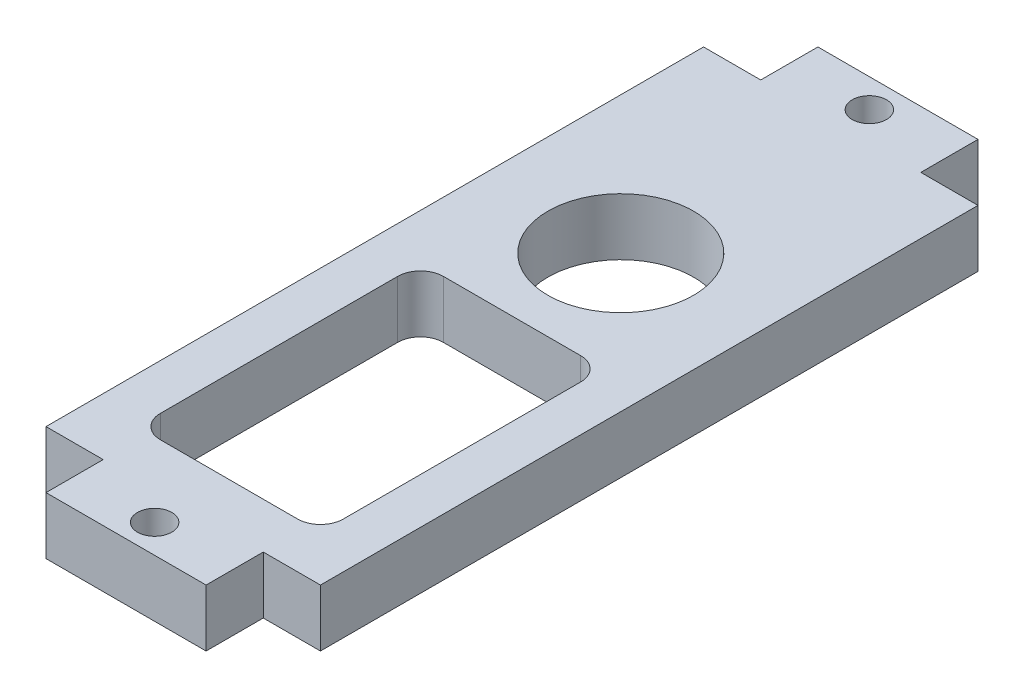
ISO-10303-21;
HEADER;
FILE_DESCRIPTION(('STEP AP214'),'2;1');
FILE_NAME('part.step','',(''),(''),'','','');
FILE_SCHEMA(('AUTOMOTIVE_DESIGN { 1 0 10303 214 1 1 1 1 }'));
ENDSEC;
DATA;
#1=APPLICATION_CONTEXT('core data for automotive mechanical design processes');
#2=APPLICATION_PROTOCOL_DEFINITION('international standard','automotive_design',2000,#1);
#3=PRODUCT_CONTEXT('',#1,'mechanical');
#4=PRODUCT('Part','Part','',(#3));
#5=PRODUCT_RELATED_PRODUCT_CATEGORY('part','',(#4));
#6=PRODUCT_DEFINITION_FORMATION('','',#4);
#7=PRODUCT_DEFINITION_CONTEXT('part definition',#1,'design');
#8=PRODUCT_DEFINITION('design','',#6,#7);
#9=PRODUCT_DEFINITION_SHAPE('','',#8);
#10=(LENGTH_UNIT() NAMED_UNIT(*) SI_UNIT(.MILLI.,.METRE.));
#11=(NAMED_UNIT(*) PLANE_ANGLE_UNIT() SI_UNIT($,.RADIAN.));
#12=(NAMED_UNIT(*) SI_UNIT($,.STERADIAN.) SOLID_ANGLE_UNIT());
#13=UNCERTAINTY_MEASURE_WITH_UNIT(LENGTH_MEASURE(1.E-05),#10,'distance_accuracy_value','');
#14=(GEOMETRIC_REPRESENTATION_CONTEXT(3) GLOBAL_UNCERTAINTY_ASSIGNED_CONTEXT((#13)) GLOBAL_UNIT_ASSIGNED_CONTEXT((#10,
#11,#12)) REPRESENTATION_CONTEXT('',''));
#15=CARTESIAN_POINT('',(0.,0.,0.));
#16=DIRECTION('',(0.,0.,1.));
#17=DIRECTION('',(1.,0.,0.));
#18=AXIS2_PLACEMENT_3D('',#15,#16,#17);
#19=CARTESIAN_POINT('',(0.,5.,0.));
#20=DIRECTION('',(0.,1.,0.));
#21=DIRECTION('',(0.,0.,1.));
#22=AXIS2_PLACEMENT_3D('',#19,#20,#21);
#23=PLANE('',#22);
#24=DIRECTION('',(1.,0.,0.));
#25=VECTOR('',#24,1.);
#26=CARTESIAN_POINT('',(0.,5.,5.));
#27=LINE('',#26,#25);
#28=CARTESIAN_POINT('',(6.,5.,5.));
#29=VERTEX_POINT('',#28);
#30=CARTESIAN_POINT('',(18.,5.,5.));
#31=VERTEX_POINT('',#30);
#32=EDGE_CURVE('E256',#29,#31,#27,.T.);
#33=ORIENTED_EDGE('',*,*,#32,.F.);
#34=CARTESIAN_POINT('',(6.,5.,3.));
#35=DIRECTION('',(0.,1.,0.));
#36=DIRECTION('',(0.,0.,1.));
#37=AXIS2_PLACEMENT_3D('',#34,#35,#36);
#38=CIRCLE('',#37,2.);
#39=CARTESIAN_POINT('',(4.,5.,3.));
#40=VERTEX_POINT('',#39);
#41=EDGE_CURVE('E240',#29,#40,#38,.F.);
#42=ORIENTED_EDGE('',*,*,#41,.T.);
#43=DIRECTION('',(0.,0.,-1.));
#44=VECTOR('',#43,1.);
#45=CARTESIAN_POINT('',(4.,5.,0.));
#46=LINE('',#45,#44);
#47=CARTESIAN_POINT('',(4.,5.,-17.75));
#48=VERTEX_POINT('',#47);
#49=EDGE_CURVE('E276',#40,#48,#46,.T.);
#50=ORIENTED_EDGE('',*,*,#49,.T.);
#51=CARTESIAN_POINT('',(6.,5.,-17.75));
#52=DIRECTION('',(0.,1.,0.));
#53=DIRECTION('',(0.,0.,1.));
#54=AXIS2_PLACEMENT_3D('',#51,#52,#53);
#55=CIRCLE('',#54,2.);
#56=CARTESIAN_POINT('',(6.,5.,-19.75));
#57=VERTEX_POINT('',#56);
#58=EDGE_CURVE('E55',#48,#57,#55,.F.);
#59=ORIENTED_EDGE('',*,*,#58,.T.);
#60=DIRECTION('',(1.,0.,0.));
#61=VECTOR('',#60,1.);
#62=CARTESIAN_POINT('',(0.,5.,-19.75));
#63=LINE('',#62,#61);
#64=CARTESIAN_POINT('',(18.,5.,-19.75));
#65=VERTEX_POINT('',#64);
#66=EDGE_CURVE('E251',#57,#65,#63,.T.);
#67=ORIENTED_EDGE('',*,*,#66,.T.);
#68=CARTESIAN_POINT('',(18.,5.,-17.75));
#69=DIRECTION('',(0.,1.,0.));
#70=DIRECTION('',(0.,0.,1.));
#71=AXIS2_PLACEMENT_3D('',#68,#69,#70);
#72=CIRCLE('',#71,2.);
#73=CARTESIAN_POINT('',(20.,5.,-17.75));
#74=VERTEX_POINT('',#73);
#75=EDGE_CURVE('E41',#65,#74,#72,.F.);
#76=ORIENTED_EDGE('',*,*,#75,.T.);
#77=DIRECTION('',(0.,0.,-1.));
#78=VECTOR('',#77,1.);
#79=CARTESIAN_POINT('',(20.,5.,0.));
#80=LINE('',#79,#78);
#81=CARTESIAN_POINT('',(20.,5.,3.));
#82=VERTEX_POINT('',#81);
#83=EDGE_CURVE('E250',#82,#74,#80,.T.);
#84=ORIENTED_EDGE('',*,*,#83,.F.);
#85=CARTESIAN_POINT('',(18.,5.,3.));
#86=DIRECTION('',(0.,1.,0.));
#87=DIRECTION('',(0.,0.,1.));
#88=AXIS2_PLACEMENT_3D('',#85,#86,#87);
#89=CIRCLE('',#88,2.);
#90=EDGE_CURVE('E236',#82,#31,#89,.F.);
#91=ORIENTED_EDGE('',*,*,#90,.T.);
#92=EDGE_LOOP('',(#33,#42,#50,#59,#67,#76,#84,#91));
#93=FACE_BOUND('',#92,.T.);
#94=CARTESIAN_POINT('',(12.,5.,-29.26));
#95=DIRECTION('',(0.,1.,0.));
#96=DIRECTION('',(0.,0.,1.));
#97=AXIS2_PLACEMENT_3D('',#94,#95,#96);
#98=CIRCLE('',#97,6.375);
#99=CARTESIAN_POINT('',(12.,5.,-22.885));
#100=VERTEX_POINT('',#99);
#101=EDGE_CURVE('E207',#100,#100,#98,.T.);
#102=ORIENTED_EDGE('',*,*,#101,.F.);
#103=EDGE_LOOP('',(#102));
#104=FACE_BOUND('',#103,.T.);
#105=CARTESIAN_POINT('',(12.,5.,-51.));
#106=DIRECTION('',(0.,1.,0.));
#107=DIRECTION('',(0.,0.,1.));
#108=AXIS2_PLACEMENT_3D('',#105,#106,#107);
#109=CIRCLE('',#108,1.5);
#110=CARTESIAN_POINT('',(12.,5.,-49.5));
#111=VERTEX_POINT('',#110);
#112=EDGE_CURVE('E300',#111,#111,#109,.T.);
#113=ORIENTED_EDGE('',*,*,#112,.F.);
#114=EDGE_LOOP('',(#113));
#115=FACE_BOUND('',#114,.T.);
#116=DIRECTION('',(0.,0.,1.));
#117=VECTOR('',#116,1.);
#118=CARTESIAN_POINT('',(5.,5.,-53.5));
#119=LINE('',#118,#117);
#120=CARTESIAN_POINT('',(5.,5.,-53.5));
#121=VERTEX_POINT('',#120);
#122=CARTESIAN_POINT('',(5.,5.,-48.5));
#123=VERTEX_POINT('',#122);
#124=EDGE_CURVE('E181',#121,#123,#119,.T.);
#125=ORIENTED_EDGE('',*,*,#124,.T.);
#126=DIRECTION('',(-1.,0.,0.));
#127=VECTOR('',#126,1.);
#128=CARTESIAN_POINT('',(0.,5.,-48.5));
#129=LINE('',#128,#127);
#130=CARTESIAN_POINT('',(0.,5.,-48.5));
#131=VERTEX_POINT('',#130);
#132=EDGE_CURVE('E170',#123,#131,#129,.T.);
#133=ORIENTED_EDGE('',*,*,#132,.T.);
#134=DIRECTION('',(0.,0.,1.));
#135=VECTOR('',#134,1.);
#136=CARTESIAN_POINT('',(0.,5.,9.));
#137=LINE('',#136,#135);
#138=CARTESIAN_POINT('',(0.,5.,9.));
#139=VERTEX_POINT('',#138);
#140=EDGE_CURVE('E180',#131,#139,#137,.T.);
#141=ORIENTED_EDGE('',*,*,#140,.T.);
#142=DIRECTION('',(1.,0.,0.));
#143=VECTOR('',#142,1.);
#144=CARTESIAN_POINT('',(0.,5.,9.));
#145=LINE('',#144,#143);
#146=CARTESIAN_POINT('',(5.,5.,9.));
#147=VERTEX_POINT('',#146);
#148=EDGE_CURVE('E306',#139,#147,#145,.T.);
#149=ORIENTED_EDGE('',*,*,#148,.T.);
#150=DIRECTION('',(0.,0.,1.));
#151=VECTOR('',#150,1.);
#152=CARTESIAN_POINT('',(5.,5.,14.));
#153=LINE('',#152,#151);
#154=CARTESIAN_POINT('',(5.,5.,14.));
#155=VERTEX_POINT('',#154);
#156=EDGE_CURVE('E308',#147,#155,#153,.T.);
#157=ORIENTED_EDGE('',*,*,#156,.T.);
#158=DIRECTION('',(1.,0.,0.));
#159=VECTOR('',#158,1.);
#160=CARTESIAN_POINT('',(5.,5.,14.));
#161=LINE('',#160,#159);
#162=CARTESIAN_POINT('',(19.,5.,14.));
#163=VERTEX_POINT('',#162);
#164=EDGE_CURVE('E310',#155,#163,#161,.T.);
#165=ORIENTED_EDGE('',*,*,#164,.T.);
#166=DIRECTION('',(0.,0.,-1.));
#167=VECTOR('',#166,1.);
#168=CARTESIAN_POINT('',(19.,5.,14.));
#169=LINE('',#168,#167);
#170=CARTESIAN_POINT('',(19.,5.,9.00000000000001));
#171=VERTEX_POINT('',#170);
#172=EDGE_CURVE('E312',#163,#171,#169,.T.);
#173=ORIENTED_EDGE('',*,*,#172,.T.);
#174=DIRECTION('',(1.,0.,0.));
#175=VECTOR('',#174,1.);
#176=CARTESIAN_POINT('',(24.,5.,9.00000000000001));
#177=LINE('',#176,#175);
#178=CARTESIAN_POINT('',(24.,5.,9.00000000000001));
#179=VERTEX_POINT('',#178);
#180=EDGE_CURVE('E314',#171,#179,#177,.T.);
#181=ORIENTED_EDGE('',*,*,#180,.T.);
#182=DIRECTION('',(0.,0.,-1.));
#183=VECTOR('',#182,1.);
#184=CARTESIAN_POINT('',(24.,5.,9.00000000000001));
#185=LINE('',#184,#183);
#186=CARTESIAN_POINT('',(24.,5.,-48.5));
#187=VERTEX_POINT('',#186);
#188=EDGE_CURVE('E316',#179,#187,#185,.T.);
#189=ORIENTED_EDGE('',*,*,#188,.T.);
#190=DIRECTION('',(-1.,0.,0.));
#191=VECTOR('',#190,1.);
#192=CARTESIAN_POINT('',(24.,5.,-48.5));
#193=LINE('',#192,#191);
#194=CARTESIAN_POINT('',(19.,5.,-48.5));
#195=VERTEX_POINT('',#194);
#196=EDGE_CURVE('E318',#187,#195,#193,.T.);
#197=ORIENTED_EDGE('',*,*,#196,.T.);
#198=DIRECTION('',(0.,0.,-1.));
#199=VECTOR('',#198,1.);
#200=CARTESIAN_POINT('',(19.,5.,-53.5));
#201=LINE('',#200,#199);
#202=CARTESIAN_POINT('',(19.,5.,-53.5));
#203=VERTEX_POINT('',#202);
#204=EDGE_CURVE('E320',#195,#203,#201,.T.);
#205=ORIENTED_EDGE('',*,*,#204,.T.);
#206=DIRECTION('',(-1.,0.,0.));
#207=VECTOR('',#206,1.);
#208=CARTESIAN_POINT('',(5.,5.,-53.5));
#209=LINE('',#208,#207);
#210=EDGE_CURVE('E186',#203,#121,#209,.T.);
#211=ORIENTED_EDGE('',*,*,#210,.T.);
#212=EDGE_LOOP('',(#125,#133,#141,#149,#157,#165,#173,#181,#189,#197,#205,#211));
#213=FACE_BOUND('',#212,.T.);
#214=CARTESIAN_POINT('',(12.,5.,11.5));
#215=DIRECTION('',(0.,1.,0.));
#216=DIRECTION('',(0.,0.,-1.));
#217=AXIS2_PLACEMENT_3D('',#214,#215,#216);
#218=CIRCLE('',#217,1.5);
#219=CARTESIAN_POINT('',(12.,5.,10.));
#220=VERTEX_POINT('',#219);
#221=EDGE_CURVE('E294',#220,#220,#218,.T.);
#222=ORIENTED_EDGE('',*,*,#221,.F.);
#223=EDGE_LOOP('',(#222));
#224=FACE_BOUND('',#223,.T.);
#225=ADVANCED_FACE('F33',(#93,#104,#115,#213,#224),#23,.T.);
#226=CARTESIAN_POINT('',(0.,0.,0.));
#227=DIRECTION('',(0.,1.,0.));
#228=DIRECTION('',(0.,0.,1.));
#229=AXIS2_PLACEMENT_3D('',#226,#227,#228);
#230=PLANE('',#229);
#231=DIRECTION('',(0.,0.,-1.));
#232=VECTOR('',#231,1.);
#233=CARTESIAN_POINT('',(4.,0.,0.));
#234=LINE('',#233,#232);
#235=CARTESIAN_POINT('',(4.,0.,3.));
#236=VERTEX_POINT('',#235);
#237=CARTESIAN_POINT('',(4.,0.,-17.75));
#238=VERTEX_POINT('',#237);
#239=EDGE_CURVE('E211',#236,#238,#234,.T.);
#240=ORIENTED_EDGE('',*,*,#239,.F.);
#241=CARTESIAN_POINT('',(6.,0.,3.));
#242=DIRECTION('',(0.,1.,0.));
#243=DIRECTION('',(0.,0.,1.));
#244=AXIS2_PLACEMENT_3D('',#241,#242,#243);
#245=CIRCLE('',#244,2.);
#246=CARTESIAN_POINT('',(6.,0.,5.));
#247=VERTEX_POINT('',#246);
#248=EDGE_CURVE('E242',#236,#247,#245,.T.);
#249=ORIENTED_EDGE('',*,*,#248,.T.);
#250=DIRECTION('',(1.,0.,0.));
#251=VECTOR('',#250,1.);
#252=CARTESIAN_POINT('',(0.,0.,5.));
#253=LINE('',#252,#251);
#254=CARTESIAN_POINT('',(18.,0.,5.));
#255=VERTEX_POINT('',#254);
#256=EDGE_CURVE('E214',#247,#255,#253,.T.);
#257=ORIENTED_EDGE('',*,*,#256,.T.);
#258=CARTESIAN_POINT('',(18.,0.,3.));
#259=DIRECTION('',(0.,1.,0.));
#260=DIRECTION('',(0.,0.,1.));
#261=AXIS2_PLACEMENT_3D('',#258,#259,#260);
#262=CIRCLE('',#261,2.);
#263=CARTESIAN_POINT('',(20.,0.,3.));
#264=VERTEX_POINT('',#263);
#265=EDGE_CURVE('E238',#255,#264,#262,.T.);
#266=ORIENTED_EDGE('',*,*,#265,.T.);
#267=DIRECTION('',(0.,0.,-1.));
#268=VECTOR('',#267,1.);
#269=CARTESIAN_POINT('',(20.,0.,0.));
#270=LINE('',#269,#268);
#271=CARTESIAN_POINT('',(20.,0.,-17.75));
#272=VERTEX_POINT('',#271);
#273=EDGE_CURVE('E195',#264,#272,#270,.T.);
#274=ORIENTED_EDGE('',*,*,#273,.T.);
#275=CARTESIAN_POINT('',(18.,0.,-17.75));
#276=DIRECTION('',(0.,1.,0.));
#277=DIRECTION('',(0.,0.,1.));
#278=AXIS2_PLACEMENT_3D('',#275,#276,#277);
#279=CIRCLE('',#278,2.);
#280=CARTESIAN_POINT('',(18.,0.,-19.75));
#281=VERTEX_POINT('',#280);
#282=EDGE_CURVE('E11',#272,#281,#279,.T.);
#283=ORIENTED_EDGE('',*,*,#282,.T.);
#284=DIRECTION('',(1.,0.,0.));
#285=VECTOR('',#284,1.);
#286=CARTESIAN_POINT('',(0.,0.,-19.75));
#287=LINE('',#286,#285);
#288=CARTESIAN_POINT('',(6.,0.,-19.75));
#289=VERTEX_POINT('',#288);
#290=EDGE_CURVE('E198',#289,#281,#287,.T.);
#291=ORIENTED_EDGE('',*,*,#290,.F.);
#292=CARTESIAN_POINT('',(6.,0.,-17.75));
#293=DIRECTION('',(0.,1.,0.));
#294=DIRECTION('',(0.,0.,1.));
#295=AXIS2_PLACEMENT_3D('',#292,#293,#294);
#296=CIRCLE('',#295,2.);
#297=EDGE_CURVE('E245',#289,#238,#296,.T.);
#298=ORIENTED_EDGE('',*,*,#297,.T.);
#299=EDGE_LOOP('',(#240,#249,#257,#266,#274,#283,#291,#298));
#300=FACE_BOUND('',#299,.T.);
#301=CARTESIAN_POINT('',(12.,0.,-29.26));
#302=DIRECTION('',(0.,1.,0.));
#303=DIRECTION('',(0.,0.,1.));
#304=AXIS2_PLACEMENT_3D('',#301,#302,#303);
#305=CIRCLE('',#304,6.375);
#306=CARTESIAN_POINT('',(12.,0.,-22.885));
#307=VERTEX_POINT('',#306);
#308=EDGE_CURVE('E204',#307,#307,#305,.T.);
#309=ORIENTED_EDGE('',*,*,#308,.T.);
#310=EDGE_LOOP('',(#309));
#311=FACE_BOUND('',#310,.T.);
#312=DIRECTION('',(0.,0.,1.));
#313=VECTOR('',#312,1.);
#314=CARTESIAN_POINT('',(5.,0.,-53.5));
#315=LINE('',#314,#313);
#316=CARTESIAN_POINT('',(5.,0.,-53.5));
#317=VERTEX_POINT('',#316);
#318=CARTESIAN_POINT('',(5.,0.,-48.5));
#319=VERTEX_POINT('',#318);
#320=EDGE_CURVE('E194',#317,#319,#315,.T.);
#321=ORIENTED_EDGE('',*,*,#320,.F.);
#322=DIRECTION('',(-1.,0.,0.));
#323=VECTOR('',#322,1.);
#324=CARTESIAN_POINT('',(5.,0.,-53.5));
#325=LINE('',#324,#323);
#326=CARTESIAN_POINT('',(19.,0.,-53.5));
#327=VERTEX_POINT('',#326);
#328=EDGE_CURVE('E190',#327,#317,#325,.T.);
#329=ORIENTED_EDGE('',*,*,#328,.F.);
#330=DIRECTION('',(0.,0.,-1.));
#331=VECTOR('',#330,1.);
#332=CARTESIAN_POINT('',(19.,0.,-53.5));
#333=LINE('',#332,#331);
#334=CARTESIAN_POINT('',(19.,0.,-48.5));
#335=VERTEX_POINT('',#334);
#336=EDGE_CURVE('E343',#335,#327,#333,.T.);
#337=ORIENTED_EDGE('',*,*,#336,.F.);
#338=DIRECTION('',(-1.,0.,0.));
#339=VECTOR('',#338,1.);
#340=CARTESIAN_POINT('',(24.,0.,-48.5));
#341=LINE('',#340,#339);
#342=CARTESIAN_POINT('',(24.,0.,-48.5));
#343=VERTEX_POINT('',#342);
#344=EDGE_CURVE('E341',#343,#335,#341,.T.);
#345=ORIENTED_EDGE('',*,*,#344,.F.);
#346=DIRECTION('',(0.,0.,-1.));
#347=VECTOR('',#346,1.);
#348=CARTESIAN_POINT('',(24.,0.,9.00000000000001));
#349=LINE('',#348,#347);
#350=CARTESIAN_POINT('',(24.,0.,9.00000000000001));
#351=VERTEX_POINT('',#350);
#352=EDGE_CURVE('E339',#351,#343,#349,.T.);
#353=ORIENTED_EDGE('',*,*,#352,.F.);
#354=DIRECTION('',(1.,0.,0.));
#355=VECTOR('',#354,1.);
#356=CARTESIAN_POINT('',(24.,0.,9.00000000000001));
#357=LINE('',#356,#355);
#358=CARTESIAN_POINT('',(19.,0.,9.00000000000001));
#359=VERTEX_POINT('',#358);
#360=EDGE_CURVE('E337',#359,#351,#357,.T.);
#361=ORIENTED_EDGE('',*,*,#360,.F.);
#362=DIRECTION('',(0.,0.,-1.));
#363=VECTOR('',#362,1.);
#364=CARTESIAN_POINT('',(19.,0.,14.));
#365=LINE('',#364,#363);
#366=CARTESIAN_POINT('',(19.,0.,14.));
#367=VERTEX_POINT('',#366);
#368=EDGE_CURVE('E335',#367,#359,#365,.T.);
#369=ORIENTED_EDGE('',*,*,#368,.F.);
#370=DIRECTION('',(1.,0.,0.));
#371=VECTOR('',#370,1.);
#372=CARTESIAN_POINT('',(5.,0.,14.));
#373=LINE('',#372,#371);
#374=CARTESIAN_POINT('',(5.,0.,14.));
#375=VERTEX_POINT('',#374);
#376=EDGE_CURVE('E333',#375,#367,#373,.T.);
#377=ORIENTED_EDGE('',*,*,#376,.F.);
#378=DIRECTION('',(0.,0.,1.));
#379=VECTOR('',#378,1.);
#380=CARTESIAN_POINT('',(5.,0.,14.));
#381=LINE('',#380,#379);
#382=CARTESIAN_POINT('',(5.,0.,9.));
#383=VERTEX_POINT('',#382);
#384=EDGE_CURVE('E331',#383,#375,#381,.T.);
#385=ORIENTED_EDGE('',*,*,#384,.F.);
#386=DIRECTION('',(1.,0.,0.));
#387=VECTOR('',#386,1.);
#388=CARTESIAN_POINT('',(0.,0.,9.));
#389=LINE('',#388,#387);
#390=CARTESIAN_POINT('',(0.,0.,9.));
#391=VERTEX_POINT('',#390);
#392=EDGE_CURVE('E329',#391,#383,#389,.T.);
#393=ORIENTED_EDGE('',*,*,#392,.F.);
#394=DIRECTION('',(0.,0.,1.));
#395=VECTOR('',#394,1.);
#396=CARTESIAN_POINT('',(0.,0.,9.));
#397=LINE('',#396,#395);
#398=CARTESIAN_POINT('',(0.,0.,-48.5));
#399=VERTEX_POINT('',#398);
#400=EDGE_CURVE('E327',#399,#391,#397,.T.);
#401=ORIENTED_EDGE('',*,*,#400,.F.);
#402=DIRECTION('',(-1.,0.,0.));
#403=VECTOR('',#402,1.);
#404=CARTESIAN_POINT('',(0.,0.,-48.5));
#405=LINE('',#404,#403);
#406=EDGE_CURVE('E325',#319,#399,#405,.T.);
#407=ORIENTED_EDGE('',*,*,#406,.F.);
#408=EDGE_LOOP('',(#321,#329,#337,#345,#353,#361,#369,#377,#385,#393,#401,#407));
#409=FACE_BOUND('',#408,.T.);
#410=CARTESIAN_POINT('',(12.,0.,-51.));
#411=DIRECTION('',(0.,1.,0.));
#412=DIRECTION('',(0.,0.,1.));
#413=AXIS2_PLACEMENT_3D('',#410,#411,#412);
#414=CIRCLE('',#413,1.5);
#415=CARTESIAN_POINT('',(12.,0.,-49.5));
#416=VERTEX_POINT('',#415);
#417=EDGE_CURVE('E297',#416,#416,#414,.T.);
#418=ORIENTED_EDGE('',*,*,#417,.T.);
#419=EDGE_LOOP('',(#418));
#420=FACE_BOUND('',#419,.T.);
#421=CARTESIAN_POINT('',(12.,0.,11.5));
#422=DIRECTION('',(0.,1.,0.));
#423=DIRECTION('',(0.,0.,-1.));
#424=AXIS2_PLACEMENT_3D('',#421,#422,#423);
#425=CIRCLE('',#424,1.5);
#426=CARTESIAN_POINT('',(12.,0.,10.));
#427=VERTEX_POINT('',#426);
#428=EDGE_CURVE('E206',#427,#427,#425,.T.);
#429=ORIENTED_EDGE('',*,*,#428,.T.);
#430=EDGE_LOOP('',(#429));
#431=FACE_BOUND('',#430,.T.);
#432=ADVANCED_FACE('F262',(#300,#311,#409,#420,#431),#230,.F.);
#433=CARTESIAN_POINT('',(5.,5.,-53.5));
#434=DIRECTION('',(1.,0.,0.));
#435=DIRECTION('',(0.,0.,-1.));
#436=AXIS2_PLACEMENT_3D('',#433,#434,#435);
#437=PLANE('',#436);
#438=ORIENTED_EDGE('',*,*,#320,.T.);
#439=DIRECTION('',(0.,-1.,0.));
#440=VECTOR('',#439,1.);
#441=CARTESIAN_POINT('',(5.,5.,-48.5));
#442=LINE('',#441,#440);
#443=EDGE_CURVE('E174',#123,#319,#442,.T.);
#444=ORIENTED_EDGE('',*,*,#443,.F.);
#445=ORIENTED_EDGE('',*,*,#124,.F.);
#446=DIRECTION('',(0.,-1.,0.));
#447=VECTOR('',#446,1.);
#448=CARTESIAN_POINT('',(5.,5.,-53.5));
#449=LINE('',#448,#447);
#450=EDGE_CURVE('E323',#121,#317,#449,.T.);
#451=ORIENTED_EDGE('',*,*,#450,.T.);
#452=EDGE_LOOP('',(#438,#444,#445,#451));
#453=FACE_BOUND('',#452,.T.);
#454=ADVANCED_FACE('F192',(#453),#437,.F.);
#455=CARTESIAN_POINT('',(0.,5.,-48.5));
#456=DIRECTION('',(0.,0.,1.));
#457=DIRECTION('',(1.,0.,0.));
#458=AXIS2_PLACEMENT_3D('',#455,#456,#457);
#459=PLANE('',#458);
#460=ORIENTED_EDGE('',*,*,#406,.T.);
#461=DIRECTION('',(0.,-1.,0.));
#462=VECTOR('',#461,1.);
#463=CARTESIAN_POINT('',(0.,5.,-48.5));
#464=LINE('',#463,#462);
#465=EDGE_CURVE('E177',#131,#399,#464,.T.);
#466=ORIENTED_EDGE('',*,*,#465,.F.);
#467=ORIENTED_EDGE('',*,*,#132,.F.);
#468=ORIENTED_EDGE('',*,*,#443,.T.);
#469=EDGE_LOOP('',(#460,#466,#467,#468));
#470=FACE_BOUND('',#469,.T.);
#471=ADVANCED_FACE('F172',(#470),#459,.F.);
#472=CARTESIAN_POINT('',(0.,5.,9.));
#473=DIRECTION('',(1.,0.,0.));
#474=DIRECTION('',(0.,0.,-1.));
#475=AXIS2_PLACEMENT_3D('',#472,#473,#474);
#476=PLANE('',#475);
#477=ORIENTED_EDGE('',*,*,#400,.T.);
#478=DIRECTION('',(0.,-1.,0.));
#479=VECTOR('',#478,1.);
#480=CARTESIAN_POINT('',(0.,5.,9.));
#481=LINE('',#480,#479);
#482=EDGE_CURVE('E200',#139,#391,#481,.T.);
#483=ORIENTED_EDGE('',*,*,#482,.F.);
#484=ORIENTED_EDGE('',*,*,#140,.F.);
#485=ORIENTED_EDGE('',*,*,#465,.T.);
#486=EDGE_LOOP('',(#477,#483,#484,#485));
#487=FACE_BOUND('',#486,.T.);
#488=ADVANCED_FACE('F394',(#487),#476,.F.);
#489=CARTESIAN_POINT('',(0.,5.,9.));
#490=DIRECTION('',(0.,0.,-1.));
#491=DIRECTION('',(-1.,0.,0.));
#492=AXIS2_PLACEMENT_3D('',#489,#490,#491);
#493=PLANE('',#492);
#494=ORIENTED_EDGE('',*,*,#392,.T.);
#495=DIRECTION('',(0.,-1.,0.));
#496=VECTOR('',#495,1.);
#497=CARTESIAN_POINT('',(5.,5.,9.));
#498=LINE('',#497,#496);
#499=EDGE_CURVE('E368',#147,#383,#498,.T.);
#500=ORIENTED_EDGE('',*,*,#499,.F.);
#501=ORIENTED_EDGE('',*,*,#148,.F.);
#502=ORIENTED_EDGE('',*,*,#482,.T.);
#503=EDGE_LOOP('',(#494,#500,#501,#502));
#504=FACE_BOUND('',#503,.T.);
#505=ADVANCED_FACE('F375',(#504),#493,.F.);
#506=CARTESIAN_POINT('',(5.,5.,14.));
#507=DIRECTION('',(1.,0.,0.));
#508=DIRECTION('',(0.,0.,-1.));
#509=AXIS2_PLACEMENT_3D('',#506,#507,#508);
#510=PLANE('',#509);
#511=ORIENTED_EDGE('',*,*,#384,.T.);
#512=DIRECTION('',(0.,-1.,0.));
#513=VECTOR('',#512,1.);
#514=CARTESIAN_POINT('',(5.,5.,14.));
#515=LINE('',#514,#513);
#516=EDGE_CURVE('E365',#155,#375,#515,.T.);
#517=ORIENTED_EDGE('',*,*,#516,.F.);
#518=ORIENTED_EDGE('',*,*,#156,.F.);
#519=ORIENTED_EDGE('',*,*,#499,.T.);
#520=EDGE_LOOP('',(#511,#517,#518,#519));
#521=FACE_BOUND('',#520,.T.);
#522=ADVANCED_FACE('F386',(#521),#510,.F.);
#523=CARTESIAN_POINT('',(5.,5.,14.));
#524=DIRECTION('',(0.,0.,-1.));
#525=DIRECTION('',(-1.,0.,0.));
#526=AXIS2_PLACEMENT_3D('',#523,#524,#525);
#527=PLANE('',#526);
#528=ORIENTED_EDGE('',*,*,#376,.T.);
#529=DIRECTION('',(0.,-1.,0.));
#530=VECTOR('',#529,1.);
#531=CARTESIAN_POINT('',(19.,5.,14.));
#532=LINE('',#531,#530);
#533=EDGE_CURVE('E362',#163,#367,#532,.T.);
#534=ORIENTED_EDGE('',*,*,#533,.F.);
#535=ORIENTED_EDGE('',*,*,#164,.F.);
#536=ORIENTED_EDGE('',*,*,#516,.T.);
#537=EDGE_LOOP('',(#528,#534,#535,#536));
#538=FACE_BOUND('',#537,.T.);
#539=ADVANCED_FACE('F390',(#538),#527,.F.);
#540=CARTESIAN_POINT('',(19.,5.,14.));
#541=DIRECTION('',(-1.,0.,0.));
#542=DIRECTION('',(0.,0.,1.));
#543=AXIS2_PLACEMENT_3D('',#540,#541,#542);
#544=PLANE('',#543);
#545=ORIENTED_EDGE('',*,*,#368,.T.);
#546=DIRECTION('',(0.,-1.,0.));
#547=VECTOR('',#546,1.);
#548=CARTESIAN_POINT('',(19.,5.,9.00000000000001));
#549=LINE('',#548,#547);
#550=EDGE_CURVE('E359',#171,#359,#549,.T.);
#551=ORIENTED_EDGE('',*,*,#550,.F.);
#552=ORIENTED_EDGE('',*,*,#172,.F.);
#553=ORIENTED_EDGE('',*,*,#533,.T.);
#554=EDGE_LOOP('',(#545,#551,#552,#553));
#555=FACE_BOUND('',#554,.T.);
#556=ADVANCED_FACE('F432',(#555),#544,.F.);
#557=CARTESIAN_POINT('',(24.,5.,9.00000000000001));
#558=DIRECTION('',(0.,0.,-1.));
#559=DIRECTION('',(-1.,0.,0.));
#560=AXIS2_PLACEMENT_3D('',#557,#558,#559);
#561=PLANE('',#560);
#562=ORIENTED_EDGE('',*,*,#360,.T.);
#563=DIRECTION('',(0.,-1.,0.));
#564=VECTOR('',#563,1.);
#565=CARTESIAN_POINT('',(24.,5.,9.00000000000001));
#566=LINE('',#565,#564);
#567=EDGE_CURVE('E356',#179,#351,#566,.T.);
#568=ORIENTED_EDGE('',*,*,#567,.F.);
#569=ORIENTED_EDGE('',*,*,#180,.F.);
#570=ORIENTED_EDGE('',*,*,#550,.T.);
#571=EDGE_LOOP('',(#562,#568,#569,#570));
#572=FACE_BOUND('',#571,.T.);
#573=ADVANCED_FACE('F428',(#572),#561,.F.);
#574=CARTESIAN_POINT('',(24.,5.,9.00000000000001));
#575=DIRECTION('',(-1.,0.,0.));
#576=DIRECTION('',(0.,0.,1.));
#577=AXIS2_PLACEMENT_3D('',#574,#575,#576);
#578=PLANE('',#577);
#579=ORIENTED_EDGE('',*,*,#352,.T.);
#580=DIRECTION('',(0.,-1.,0.));
#581=VECTOR('',#580,1.);
#582=CARTESIAN_POINT('',(24.,5.,-48.5));
#583=LINE('',#582,#581);
#584=EDGE_CURVE('E353',#187,#343,#583,.T.);
#585=ORIENTED_EDGE('',*,*,#584,.F.);
#586=ORIENTED_EDGE('',*,*,#188,.F.);
#587=ORIENTED_EDGE('',*,*,#567,.T.);
#588=EDGE_LOOP('',(#579,#585,#586,#587));
#589=FACE_BOUND('',#588,.T.);
#590=ADVANCED_FACE('F424',(#589),#578,.F.);
#591=CARTESIAN_POINT('',(24.,5.,-48.5));
#592=DIRECTION('',(0.,0.,1.));
#593=DIRECTION('',(1.,0.,0.));
#594=AXIS2_PLACEMENT_3D('',#591,#592,#593);
#595=PLANE('',#594);
#596=ORIENTED_EDGE('',*,*,#344,.T.);
#597=DIRECTION('',(0.,-1.,0.));
#598=VECTOR('',#597,1.);
#599=CARTESIAN_POINT('',(19.,5.,-48.5));
#600=LINE('',#599,#598);
#601=EDGE_CURVE('E350',#195,#335,#600,.T.);
#602=ORIENTED_EDGE('',*,*,#601,.F.);
#603=ORIENTED_EDGE('',*,*,#196,.F.);
#604=ORIENTED_EDGE('',*,*,#584,.T.);
#605=EDGE_LOOP('',(#596,#602,#603,#604));
#606=FACE_BOUND('',#605,.T.);
#607=ADVANCED_FACE('F420',(#606),#595,.F.);
#608=CARTESIAN_POINT('',(19.,5.,-53.5));
#609=DIRECTION('',(-1.,0.,0.));
#610=DIRECTION('',(0.,0.,1.));
#611=AXIS2_PLACEMENT_3D('',#608,#609,#610);
#612=PLANE('',#611);
#613=ORIENTED_EDGE('',*,*,#336,.T.);
#614=DIRECTION('',(0.,-1.,0.));
#615=VECTOR('',#614,1.);
#616=CARTESIAN_POINT('',(19.,5.,-53.5));
#617=LINE('',#616,#615);
#618=EDGE_CURVE('E347',#203,#327,#617,.T.);
#619=ORIENTED_EDGE('',*,*,#618,.F.);
#620=ORIENTED_EDGE('',*,*,#204,.F.);
#621=ORIENTED_EDGE('',*,*,#601,.T.);
#622=EDGE_LOOP('',(#613,#619,#620,#621));
#623=FACE_BOUND('',#622,.T.);
#624=ADVANCED_FACE('F416',(#623),#612,.F.);
#625=CARTESIAN_POINT('',(5.,5.,-53.5));
#626=DIRECTION('',(0.,0.,1.));
#627=DIRECTION('',(1.,0.,0.));
#628=AXIS2_PLACEMENT_3D('',#625,#626,#627);
#629=PLANE('',#628);
#630=ORIENTED_EDGE('',*,*,#328,.T.);
#631=ORIENTED_EDGE('',*,*,#450,.F.);
#632=ORIENTED_EDGE('',*,*,#210,.F.);
#633=ORIENTED_EDGE('',*,*,#618,.T.);
#634=EDGE_LOOP('',(#630,#631,#632,#633));
#635=FACE_BOUND('',#634,.T.);
#636=ADVANCED_FACE('F413',(#635),#629,.F.);
#637=CARTESIAN_POINT('',(12.,5.,-51.));
#638=DIRECTION('',(0.,-1.,0.));
#639=DIRECTION('',(0.,0.,-1.));
#640=AXIS2_PLACEMENT_3D('',#637,#638,#639);
#641=CYLINDRICAL_SURFACE('',#640,1.5);
#642=ORIENTED_EDGE('',*,*,#112,.T.);
#643=EDGE_LOOP('',(#642));
#644=FACE_BOUND('',#643,.T.);
#645=ORIENTED_EDGE('',*,*,#417,.F.);
#646=EDGE_LOOP('',(#645));
#647=FACE_BOUND('',#646,.T.);
#648=ADVANCED_FACE('F410',(#644,#647),#641,.F.);
#649=CARTESIAN_POINT('',(12.,5.,11.5));
#650=DIRECTION('',(0.,-1.,0.));
#651=DIRECTION('',(0.,0.,-1.));
#652=AXIS2_PLACEMENT_3D('',#649,#650,#651);
#653=CYLINDRICAL_SURFACE('',#652,1.5);
#654=ORIENTED_EDGE('',*,*,#221,.T.);
#655=EDGE_LOOP('',(#654));
#656=FACE_BOUND('',#655,.T.);
#657=ORIENTED_EDGE('',*,*,#428,.F.);
#658=EDGE_LOOP('',(#657));
#659=FACE_BOUND('',#658,.T.);
#660=ADVANCED_FACE('F478',(#656,#659),#653,.F.);
#661=CARTESIAN_POINT('',(12.,-5.,-29.26));
#662=DIRECTION('',(0.,1.,0.));
#663=DIRECTION('',(0.,0.,1.));
#664=AXIS2_PLACEMENT_3D('',#661,#662,#663);
#665=CYLINDRICAL_SURFACE('',#664,6.375);
#666=ORIENTED_EDGE('',*,*,#101,.T.);
#667=EDGE_LOOP('',(#666));
#668=FACE_BOUND('',#667,.T.);
#669=ORIENTED_EDGE('',*,*,#308,.F.);
#670=EDGE_LOOP('',(#669));
#671=FACE_BOUND('',#670,.T.);
#672=ADVANCED_FACE('F485',(#668,#671),#665,.F.);
#673=CARTESIAN_POINT('',(0.,-5.,5.));
#674=DIRECTION('',(0.,0.,1.));
#675=DIRECTION('',(1.,0.,0.));
#676=AXIS2_PLACEMENT_3D('',#673,#674,#675);
#677=PLANE('',#676);
#678=ORIENTED_EDGE('',*,*,#32,.T.);
#679=DIRECTION('',(0.,1.,0.));
#680=VECTOR('',#679,1.);
#681=CARTESIAN_POINT('',(18.,0.,5.));
#682=LINE('',#681,#680);
#683=EDGE_CURVE('E225',#31,#255,#682,.F.);
#684=ORIENTED_EDGE('',*,*,#683,.T.);
#685=ORIENTED_EDGE('',*,*,#256,.F.);
#686=DIRECTION('',(0.,1.,0.));
#687=VECTOR('',#686,1.);
#688=CARTESIAN_POINT('',(6.,-5.,5.));
#689=LINE('',#688,#687);
#690=EDGE_CURVE('E222',#247,#29,#689,.T.);
#691=ORIENTED_EDGE('',*,*,#690,.T.);
#692=EDGE_LOOP('',(#678,#684,#685,#691));
#693=FACE_BOUND('',#692,.T.);
#694=ADVANCED_FACE('F284',(#693),#677,.F.);
#695=CARTESIAN_POINT('',(4.,-5.,0.));
#696=DIRECTION('',(1.,0.,0.));
#697=DIRECTION('',(0.,0.,-1.));
#698=AXIS2_PLACEMENT_3D('',#695,#696,#697);
#699=PLANE('',#698);
#700=ORIENTED_EDGE('',*,*,#49,.F.);
#701=DIRECTION('',(0.,1.,0.));
#702=VECTOR('',#701,1.);
#703=CARTESIAN_POINT('',(4.,-5.,3.));
#704=LINE('',#703,#702);
#705=EDGE_CURVE('E230',#40,#236,#704,.F.);
#706=ORIENTED_EDGE('',*,*,#705,.T.);
#707=ORIENTED_EDGE('',*,*,#239,.T.);
#708=DIRECTION('',(0.,1.,0.));
#709=VECTOR('',#708,1.);
#710=CARTESIAN_POINT('',(4.,5.,-17.75));
#711=LINE('',#710,#709);
#712=EDGE_CURVE('E227',#238,#48,#711,.T.);
#713=ORIENTED_EDGE('',*,*,#712,.T.);
#714=EDGE_LOOP('',(#700,#706,#707,#713));
#715=FACE_BOUND('',#714,.T.);
#716=ADVANCED_FACE('F274',(#715),#699,.T.);
#717=CARTESIAN_POINT('',(0.,-5.,-19.75));
#718=DIRECTION('',(0.,0.,1.));
#719=DIRECTION('',(1.,0.,0.));
#720=AXIS2_PLACEMENT_3D('',#717,#718,#719);
#721=PLANE('',#720);
#722=ORIENTED_EDGE('',*,*,#66,.F.);
#723=DIRECTION('',(0.,1.,0.));
#724=VECTOR('',#723,1.);
#725=CARTESIAN_POINT('',(6.,0.,-19.75));
#726=LINE('',#725,#724);
#727=EDGE_CURVE('E234',#57,#289,#726,.F.);
#728=ORIENTED_EDGE('',*,*,#727,.T.);
#729=ORIENTED_EDGE('',*,*,#290,.T.);
#730=DIRECTION('',(0.,1.,0.));
#731=VECTOR('',#730,1.);
#732=CARTESIAN_POINT('',(18.,-5.,-19.75));
#733=LINE('',#732,#731);
#734=EDGE_CURVE('E232',#281,#65,#733,.T.);
#735=ORIENTED_EDGE('',*,*,#734,.T.);
#736=EDGE_LOOP('',(#722,#728,#729,#735));
#737=FACE_BOUND('',#736,.T.);
#738=ADVANCED_FACE('F266',(#737),#721,.T.);
#739=CARTESIAN_POINT('',(20.,-5.,0.));
#740=DIRECTION('',(1.,0.,0.));
#741=DIRECTION('',(0.,0.,-1.));
#742=AXIS2_PLACEMENT_3D('',#739,#740,#741);
#743=PLANE('',#742);
#744=ORIENTED_EDGE('',*,*,#273,.F.);
#745=DIRECTION('',(0.,1.,0.));
#746=VECTOR('',#745,1.);
#747=CARTESIAN_POINT('',(20.,5.,3.));
#748=LINE('',#747,#746);
#749=EDGE_CURVE('E219',#264,#82,#748,.T.);
#750=ORIENTED_EDGE('',*,*,#749,.T.);
#751=ORIENTED_EDGE('',*,*,#83,.T.);
#752=DIRECTION('',(0.,1.,0.));
#753=VECTOR('',#752,1.);
#754=CARTESIAN_POINT('',(20.,-5.,-17.75));
#755=LINE('',#754,#753);
#756=EDGE_CURVE('E217',#74,#272,#755,.F.);
#757=ORIENTED_EDGE('',*,*,#756,.T.);
#758=EDGE_LOOP('',(#744,#750,#751,#757));
#759=FACE_BOUND('',#758,.T.);
#760=ADVANCED_FACE('F254',(#759),#743,.F.);
#761=CARTESIAN_POINT('',(18.,-5.,3.));
#762=DIRECTION('',(0.,-1.,0.));
#763=DIRECTION('',(0.,0.,-1.));
#764=AXIS2_PLACEMENT_3D('',#761,#762,#763);
#765=CYLINDRICAL_SURFACE('',#764,2.);
#766=ORIENTED_EDGE('',*,*,#265,.F.);
#767=ORIENTED_EDGE('',*,*,#683,.F.);
#768=ORIENTED_EDGE('',*,*,#90,.F.);
#769=ORIENTED_EDGE('',*,*,#749,.F.);
#770=EDGE_LOOP('',(#766,#767,#768,#769));
#771=FACE_BOUND('',#770,.T.);
#772=ADVANCED_FACE('F287',(#771),#765,.F.);
#773=CARTESIAN_POINT('',(6.,-5.,3.));
#774=DIRECTION('',(0.,1.,0.));
#775=DIRECTION('',(0.,0.,1.));
#776=AXIS2_PLACEMENT_3D('',#773,#774,#775);
#777=CYLINDRICAL_SURFACE('',#776,2.);
#778=ORIENTED_EDGE('',*,*,#248,.F.);
#779=ORIENTED_EDGE('',*,*,#705,.F.);
#780=ORIENTED_EDGE('',*,*,#41,.F.);
#781=ORIENTED_EDGE('',*,*,#690,.F.);
#782=EDGE_LOOP('',(#778,#779,#780,#781));
#783=FACE_BOUND('',#782,.T.);
#784=ADVANCED_FACE('F278',(#783),#777,.F.);
#785=CARTESIAN_POINT('',(6.,-5.,-17.75));
#786=DIRECTION('',(0.,-1.,0.));
#787=DIRECTION('',(0.,0.,-1.));
#788=AXIS2_PLACEMENT_3D('',#785,#786,#787);
#789=CYLINDRICAL_SURFACE('',#788,2.);
#790=ORIENTED_EDGE('',*,*,#297,.F.);
#791=ORIENTED_EDGE('',*,*,#727,.F.);
#792=ORIENTED_EDGE('',*,*,#58,.F.);
#793=ORIENTED_EDGE('',*,*,#712,.F.);
#794=EDGE_LOOP('',(#790,#791,#792,#793));
#795=FACE_BOUND('',#794,.T.);
#796=ADVANCED_FACE('F269',(#795),#789,.F.);
#797=CARTESIAN_POINT('',(18.,-5.,-17.75));
#798=DIRECTION('',(0.,1.,0.));
#799=DIRECTION('',(0.,0.,1.));
#800=AXIS2_PLACEMENT_3D('',#797,#798,#799);
#801=CYLINDRICAL_SURFACE('',#800,2.);
#802=ORIENTED_EDGE('',*,*,#282,.F.);
#803=ORIENTED_EDGE('',*,*,#756,.F.);
#804=ORIENTED_EDGE('',*,*,#75,.F.);
#805=ORIENTED_EDGE('',*,*,#734,.F.);
#806=EDGE_LOOP('',(#802,#803,#804,#805));
#807=FACE_BOUND('',#806,.T.);
#808=ADVANCED_FACE('F35',(#807),#801,.F.);
#809=CLOSED_SHELL('',(#225,#432,#454,#471,#488,#505,#522,#539,#556,#573,#590,#607,#624,#636,
#648,#660,#672,#694,#716,#738,#760,#772,#784,#796,#808));
#810=MANIFOLD_SOLID_BREP('B2',#809);
#811=ADVANCED_BREP_SHAPE_REPRESENTATION('',(#18,#810),#14);
#812=SHAPE_DEFINITION_REPRESENTATION(#9,#811);
ENDSEC;
END-ISO-10303-21;
